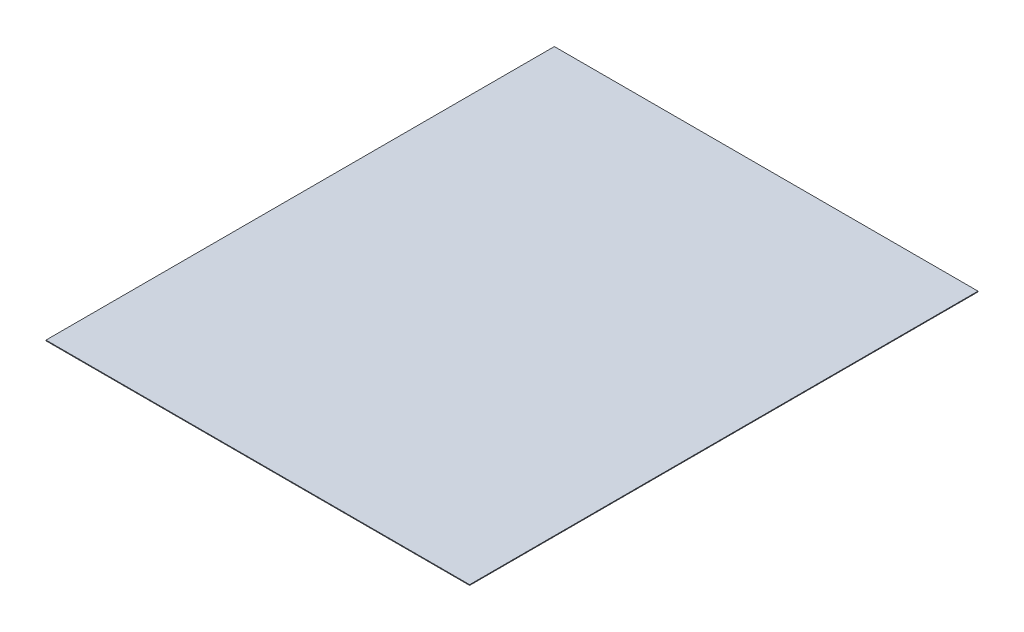
ISO-10303-21;
HEADER;
FILE_DESCRIPTION(('STEP AP214'),'2;1');
FILE_NAME('part.step','',(''),(''),'','','');
FILE_SCHEMA(('AUTOMOTIVE_DESIGN { 1 0 10303 214 1 1 1 1 }'));
ENDSEC;
DATA;
#1=APPLICATION_CONTEXT('core data for automotive mechanical design processes');
#2=APPLICATION_PROTOCOL_DEFINITION('international standard','automotive_design',2000,#1);
#3=PRODUCT_CONTEXT('',#1,'mechanical');
#4=PRODUCT('Part','Part','',(#3));
#5=PRODUCT_RELATED_PRODUCT_CATEGORY('part','',(#4));
#6=PRODUCT_DEFINITION_FORMATION('','',#4);
#7=PRODUCT_DEFINITION_CONTEXT('part definition',#1,'design');
#8=PRODUCT_DEFINITION('design','',#6,#7);
#9=PRODUCT_DEFINITION_SHAPE('','',#8);
#10=(LENGTH_UNIT() NAMED_UNIT(*) SI_UNIT(.MILLI.,.METRE.));
#11=(NAMED_UNIT(*) PLANE_ANGLE_UNIT() SI_UNIT($,.RADIAN.));
#12=(NAMED_UNIT(*) SI_UNIT($,.STERADIAN.) SOLID_ANGLE_UNIT());
#13=UNCERTAINTY_MEASURE_WITH_UNIT(LENGTH_MEASURE(1.E-05),#10,'distance_accuracy_value','');
#14=(GEOMETRIC_REPRESENTATION_CONTEXT(3) GLOBAL_UNCERTAINTY_ASSIGNED_CONTEXT((#13)) GLOBAL_UNIT_ASSIGNED_CONTEXT((#10,
#11,#12)) REPRESENTATION_CONTEXT('',''));
#15=CARTESIAN_POINT('',(0.,0.,0.));
#16=DIRECTION('',(0.,0.,1.));
#17=DIRECTION('',(1.,0.,0.));
#18=AXIS2_PLACEMENT_3D('',#15,#16,#17);
#19=CARTESIAN_POINT('',(3000.,10.,-3600.));
#20=DIRECTION('',(-1.,0.,0.));
#21=DIRECTION('',(0.,0.,1.));
#22=AXIS2_PLACEMENT_3D('',#19,#20,#21);
#23=PLANE('',#22);
#24=DIRECTION('',(0.,0.,-1.));
#25=VECTOR('',#24,1.);
#26=CARTESIAN_POINT('',(3000.,0.,-3600.));
#27=LINE('',#26,#25);
#28=CARTESIAN_POINT('',(3000.,0.,3600.));
#29=VERTEX_POINT('',#28);
#30=CARTESIAN_POINT('',(3000.,0.,-3600.));
#31=VERTEX_POINT('',#30);
#32=EDGE_CURVE('E95',#29,#31,#27,.T.);
#33=ORIENTED_EDGE('',*,*,#32,.T.);
#34=DIRECTION('',(0.,-1.,0.));
#35=VECTOR('',#34,1.);
#36=CARTESIAN_POINT('',(3000.,10.,-3600.));
#37=LINE('',#36,#35);
#38=CARTESIAN_POINT('',(3000.,10.,-3600.));
#39=VERTEX_POINT('',#38);
#40=EDGE_CURVE('E11',#39,#31,#37,.T.);
#41=ORIENTED_EDGE('',*,*,#40,.F.);
#42=DIRECTION('',(0.,0.,-1.));
#43=VECTOR('',#42,1.);
#44=CARTESIAN_POINT('',(3000.,10.,-3600.));
#45=LINE('',#44,#43);
#46=CARTESIAN_POINT('',(3000.,10.,3600.));
#47=VERTEX_POINT('',#46);
#48=EDGE_CURVE('E83',#47,#39,#45,.T.);
#49=ORIENTED_EDGE('',*,*,#48,.F.);
#50=DIRECTION('',(0.,-1.,0.));
#51=VECTOR('',#50,1.);
#52=CARTESIAN_POINT('',(3000.,10.,3600.));
#53=LINE('',#52,#51);
#54=EDGE_CURVE('E91',#47,#29,#53,.T.);
#55=ORIENTED_EDGE('',*,*,#54,.T.);
#56=EDGE_LOOP('',(#33,#41,#49,#55));
#57=FACE_BOUND('',#56,.T.);
#58=ADVANCED_FACE('F32',(#57),#23,.F.);
#59=CARTESIAN_POINT('',(-3000.,10.,-3600.));
#60=DIRECTION('',(0.,0.,1.));
#61=DIRECTION('',(1.,0.,0.));
#62=AXIS2_PLACEMENT_3D('',#59,#60,#61);
#63=PLANE('',#62);
#64=DIRECTION('',(-1.,0.,0.));
#65=VECTOR('',#64,1.);
#66=CARTESIAN_POINT('',(-3000.,0.,-3600.));
#67=LINE('',#66,#65);
#68=CARTESIAN_POINT('',(-3000.,0.,-3600.));
#69=VERTEX_POINT('',#68);
#70=EDGE_CURVE('E87',#31,#69,#67,.T.);
#71=ORIENTED_EDGE('',*,*,#70,.T.);
#72=DIRECTION('',(0.,-1.,0.));
#73=VECTOR('',#72,1.);
#74=CARTESIAN_POINT('',(-3000.,10.,-3600.));
#75=LINE('',#74,#73);
#76=CARTESIAN_POINT('',(-3000.,10.,-3600.));
#77=VERTEX_POINT('',#76);
#78=EDGE_CURVE('E40',#77,#69,#75,.T.);
#79=ORIENTED_EDGE('',*,*,#78,.F.);
#80=DIRECTION('',(-1.,0.,0.));
#81=VECTOR('',#80,1.);
#82=CARTESIAN_POINT('',(-3000.,10.,-3600.));
#83=LINE('',#82,#81);
#84=EDGE_CURVE('E78',#39,#77,#83,.T.);
#85=ORIENTED_EDGE('',*,*,#84,.F.);
#86=ORIENTED_EDGE('',*,*,#40,.T.);
#87=EDGE_LOOP('',(#71,#79,#85,#86));
#88=FACE_BOUND('',#87,.T.);
#89=ADVANCED_FACE('F86',(#88),#63,.F.);
#90=CARTESIAN_POINT('',(-3000.,10.,-3600.));
#91=DIRECTION('',(1.,0.,0.));
#92=DIRECTION('',(0.,0.,-1.));
#93=AXIS2_PLACEMENT_3D('',#90,#91,#92);
#94=PLANE('',#93);
#95=DIRECTION('',(0.,0.,1.));
#96=VECTOR('',#95,1.);
#97=CARTESIAN_POINT('',(-3000.,0.,-3600.));
#98=LINE('',#97,#96);
#99=CARTESIAN_POINT('',(-3000.,0.,3600.));
#100=VERTEX_POINT('',#99);
#101=EDGE_CURVE('E65',#69,#100,#98,.T.);
#102=ORIENTED_EDGE('',*,*,#101,.T.);
#103=DIRECTION('',(0.,-1.,0.));
#104=VECTOR('',#103,1.);
#105=CARTESIAN_POINT('',(-3000.,10.,3600.));
#106=LINE('',#105,#104);
#107=CARTESIAN_POINT('',(-3000.,10.,3600.));
#108=VERTEX_POINT('',#107);
#109=EDGE_CURVE('E88',#108,#100,#106,.T.);
#110=ORIENTED_EDGE('',*,*,#109,.F.);
#111=DIRECTION('',(0.,0.,1.));
#112=VECTOR('',#111,1.);
#113=CARTESIAN_POINT('',(-3000.,10.,-3600.));
#114=LINE('',#113,#112);
#115=EDGE_CURVE('E81',#77,#108,#114,.T.);
#116=ORIENTED_EDGE('',*,*,#115,.F.);
#117=ORIENTED_EDGE('',*,*,#78,.T.);
#118=EDGE_LOOP('',(#102,#110,#116,#117));
#119=FACE_BOUND('',#118,.T.);
#120=ADVANCED_FACE('F89',(#119),#94,.F.);
#121=CARTESIAN_POINT('',(-3000.,10.,3600.));
#122=DIRECTION('',(0.,0.,-1.));
#123=DIRECTION('',(-1.,0.,0.));
#124=AXIS2_PLACEMENT_3D('',#121,#122,#123);
#125=PLANE('',#124);
#126=DIRECTION('',(1.,0.,0.));
#127=VECTOR('',#126,1.);
#128=CARTESIAN_POINT('',(-3000.,0.,3600.));
#129=LINE('',#128,#127);
#130=EDGE_CURVE('E71',#100,#29,#129,.T.);
#131=ORIENTED_EDGE('',*,*,#130,.T.);
#132=ORIENTED_EDGE('',*,*,#54,.F.);
#133=DIRECTION('',(1.,0.,0.));
#134=VECTOR('',#133,1.);
#135=CARTESIAN_POINT('',(-3000.,10.,3600.));
#136=LINE('',#135,#134);
#137=EDGE_CURVE('E48',#108,#47,#136,.T.);
#138=ORIENTED_EDGE('',*,*,#137,.F.);
#139=ORIENTED_EDGE('',*,*,#109,.T.);
#140=EDGE_LOOP('',(#131,#132,#138,#139));
#141=FACE_BOUND('',#140,.T.);
#142=ADVANCED_FACE('F102',(#141),#125,.F.);
#143=CARTESIAN_POINT('',(0.,10.,0.));
#144=DIRECTION('',(0.,1.,0.));
#145=DIRECTION('',(0.,0.,1.));
#146=AXIS2_PLACEMENT_3D('',#143,#144,#145);
#147=PLANE('',#146);
#148=ORIENTED_EDGE('',*,*,#48,.T.);
#149=ORIENTED_EDGE('',*,*,#84,.T.);
#150=ORIENTED_EDGE('',*,*,#115,.T.);
#151=ORIENTED_EDGE('',*,*,#137,.T.);
#152=EDGE_LOOP('',(#148,#149,#150,#151));
#153=FACE_BOUND('',#152,.T.);
#154=ADVANCED_FACE('F79',(#153),#147,.T.);
#155=CARTESIAN_POINT('',(0.,0.,0.));
#156=DIRECTION('',(0.,1.,0.));
#157=DIRECTION('',(0.,0.,1.));
#158=AXIS2_PLACEMENT_3D('',#155,#156,#157);
#159=PLANE('',#158);
#160=ORIENTED_EDGE('',*,*,#32,.F.);
#161=ORIENTED_EDGE('',*,*,#130,.F.);
#162=ORIENTED_EDGE('',*,*,#101,.F.);
#163=ORIENTED_EDGE('',*,*,#70,.F.);
#164=EDGE_LOOP('',(#160,#161,#162,#163));
#165=FACE_BOUND('',#164,.T.);
#166=ADVANCED_FACE('F105',(#165),#159,.F.);
#167=CLOSED_SHELL('',(#58,#89,#120,#142,#154,#166));
#168=MANIFOLD_SOLID_BREP('B2',#167);
#169=ADVANCED_BREP_SHAPE_REPRESENTATION('',(#18,#168),#14);
#170=SHAPE_DEFINITION_REPRESENTATION(#9,#169);
ENDSEC;
END-ISO-10303-21;
